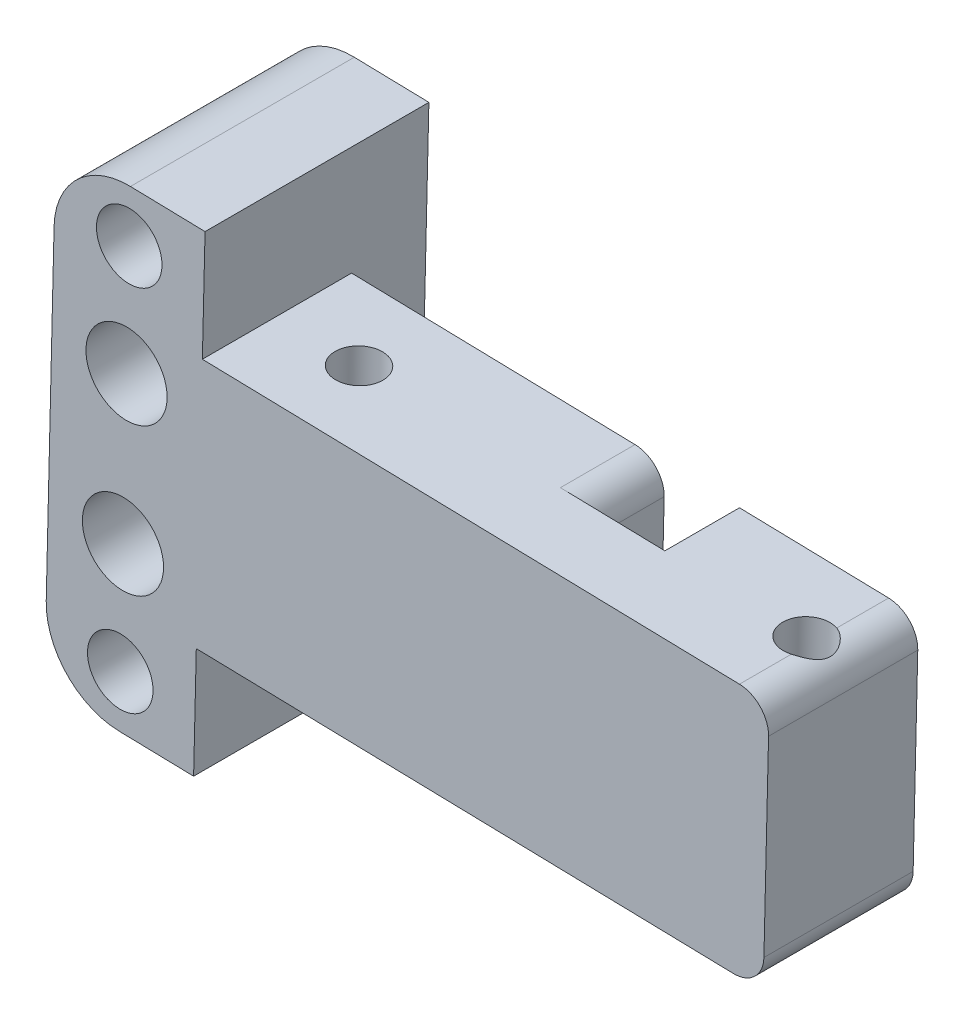
ISO-10303-21;
HEADER;
FILE_DESCRIPTION(('STEP AP214'),'2;1');
FILE_NAME('part.step','',(''),(''),'','','');
FILE_SCHEMA(('AUTOMOTIVE_DESIGN { 1 0 10303 214 1 1 1 1 }'));
ENDSEC;
DATA;
#1=APPLICATION_CONTEXT('core data for automotive mechanical design processes');
#2=APPLICATION_PROTOCOL_DEFINITION('international standard','automotive_design',2000,#1);
#3=PRODUCT_CONTEXT('',#1,'mechanical');
#4=PRODUCT('Part','Part','',(#3));
#5=PRODUCT_RELATED_PRODUCT_CATEGORY('part','',(#4));
#6=PRODUCT_DEFINITION_FORMATION('','',#4);
#7=PRODUCT_DEFINITION_CONTEXT('part definition',#1,'design');
#8=PRODUCT_DEFINITION('design','',#6,#7);
#9=PRODUCT_DEFINITION_SHAPE('','',#8);
#10=(LENGTH_UNIT() NAMED_UNIT(*) SI_UNIT(.MILLI.,.METRE.));
#11=(NAMED_UNIT(*) PLANE_ANGLE_UNIT() SI_UNIT($,.RADIAN.));
#12=(NAMED_UNIT(*) SI_UNIT($,.STERADIAN.) SOLID_ANGLE_UNIT());
#13=UNCERTAINTY_MEASURE_WITH_UNIT(LENGTH_MEASURE(1.E-05),#10,'distance_accuracy_value','');
#14=(GEOMETRIC_REPRESENTATION_CONTEXT(3) GLOBAL_UNCERTAINTY_ASSIGNED_CONTEXT((#13)) GLOBAL_UNIT_ASSIGNED_CONTEXT((#10,
#11,#12)) REPRESENTATION_CONTEXT('',''));
#15=CARTESIAN_POINT('',(0.,0.,0.));
#16=DIRECTION('',(0.,0.,1.));
#17=DIRECTION('',(1.,0.,0.));
#18=AXIS2_PLACEMENT_3D('',#15,#16,#17);
#19=CARTESIAN_POINT('',(0.,0.,-9.99999999999999));
#20=DIRECTION('',(0.,0.,-1.));
#21=DIRECTION('',(-1.,0.,0.));
#22=AXIS2_PLACEMENT_3D('',#19,#20,#21);
#23=PLANE('',#22);
#24=DIRECTION('',(-0.0239500585247725,-0.99971315620865,0.));
#25=VECTOR('',#24,1.);
#26=CARTESIAN_POINT('',(12.3427221080172,-0.295693734753971,-9.99999999999999));
#27=LINE('',#26,#25);
#28=CARTESIAN_POINT('',(12.5478530872036,8.26679634961967,-9.99999999999999));
#29=VERTEX_POINT('',#28);
#30=CARTESIAN_POINT('',(12.1407020922824,-8.72832730592735,-9.99999999999999));
#31=VERTEX_POINT('',#30);
#32=EDGE_CURVE('E180',#29,#31,#27,.T.);
#33=ORIENTED_EDGE('',*,*,#32,.F.);
#34=DIRECTION('',(-0.99971315620865,0.0239500585247725,0.));
#35=VECTOR('',#34,1.);
#36=CARTESIAN_POINT('',(22.5449846492901,8.02729576437194,-9.99999999999999));
#37=LINE('',#36,#35);
#38=CARTESIAN_POINT('',(22.5449846492901,8.02729576437194,-9.99999999999999));
#39=VERTEX_POINT('',#38);
#40=EDGE_CURVE('E188',#39,#29,#37,.T.);
#41=ORIENTED_EDGE('',*,*,#40,.F.);
#42=CARTESIAN_POINT('',(22.4970845322405,6.02786945195466,-9.99999999999999));
#43=DIRECTION('',(0.,0.,-1.));
#44=DIRECTION('',(-1.,0.,0.));
#45=AXIS2_PLACEMENT_3D('',#42,#43,#44);
#46=CIRCLE('',#45,1.99999999999999);
#47=CARTESIAN_POINT('',(24.4965108446578,5.97996933490513,-9.99999999999999));
#48=VERTEX_POINT('',#47);
#49=EDGE_CURVE('E205',#48,#39,#46,.F.);
#50=ORIENTED_EDGE('',*,*,#49,.F.);
#51=DIRECTION('',(0.0239500585247739,0.99971315620865,0.));
#52=VECTOR('',#51,1.);
#53=CARTESIAN_POINT('',(24.1851600838358,-7.0163016958073,-9.99999999999999));
#54=LINE('',#53,#52);
#55=CARTESIAN_POINT('',(24.1851600838358,-7.0163016958073,-9.99999999999999));
#56=VERTEX_POINT('',#55);
#57=EDGE_CURVE('E294',#56,#48,#54,.T.);
#58=ORIENTED_EDGE('',*,*,#57,.F.);
#59=CARTESIAN_POINT('',(22.1857337714185,-6.96840157875778,-9.99999999999999));
#60=DIRECTION('',(0.,0.,-1.));
#61=DIRECTION('',(-1.,0.,0.));
#62=AXIS2_PLACEMENT_3D('',#59,#60,#61);
#63=CIRCLE('',#62,1.99999999999999);
#64=CARTESIAN_POINT('',(22.1378336543689,-8.96782789117506,-9.99999999999999));
#65=VERTEX_POINT('',#64);
#66=EDGE_CURVE('E200',#65,#56,#63,.F.);
#67=ORIENTED_EDGE('',*,*,#66,.F.);
#68=DIRECTION('',(0.99971315620865,-0.0239500585247709,0.));
#69=VECTOR('',#68,1.);
#70=CARTESIAN_POINT('',(-13.8518399691425,-8.10562578428331,-9.99999999999999));
#71=LINE('',#70,#69);
#72=EDGE_CURVE('E191',#31,#65,#71,.T.);
#73=ORIENTED_EDGE('',*,*,#72,.F.);
#74=EDGE_LOOP('',(#33,#41,#50,#58,#67,#73));
#75=FACE_BOUND('',#74,.T.);
#76=ADVANCED_FACE('F41',(#75),#23,.T.);
#77=CARTESIAN_POINT('',(22.1857337714185,-6.96840157875778,-15.));
#78=DIRECTION('',(0.,0.,1.));
#79=DIRECTION('',(1.,0.,0.));
#80=AXIS2_PLACEMENT_3D('',#77,#78,#79);
#81=CYLINDRICAL_SURFACE('',#80,1.99999999999999);
#82=CARTESIAN_POINT('',(22.1378336543689,-8.96782789117506,-6.51986841535706));
#83=CARTESIAN_POINT('',(22.177541900737,-8.96878397799436,-6.50680601406822));
#84=CARTESIAN_POINT('',(22.2167322632791,-8.96853392166363,-6.49218826153607));
#85=CARTESIAN_POINT('',(22.2937611262488,-8.96585248375136,-6.46000515692447));
#86=CARTESIAN_POINT('',(22.3316009830091,-8.96342335862773,-6.44244286924733));
#87=CARTESIAN_POINT('',(22.4421612860829,-8.95326547218641,-6.38583593186457));
#88=CARTESIAN_POINT('',(22.5125543368794,-8.942673736842,-6.34266113831798));
#89=CARTESIAN_POINT('',(22.6450120591151,-8.91612489874949,-6.24699745860863));
#90=CARTESIAN_POINT('',(22.7071062830459,-8.90018758458956,-6.19454325711621));
#91=CARTESIAN_POINT('',(22.8225043134501,-8.86528436031947,-6.08135550889079));
#92=CARTESIAN_POINT('',(22.8757860635989,-8.84631107810625,-6.02060186290768));
#93=CARTESIAN_POINT('',(22.9779607586305,-8.80571491632614,-5.88488792564651));
#94=CARTESIAN_POINT('',(23.0257333599725,-8.78402948541162,-5.80910040734161));
#95=CARTESIAN_POINT('',(23.1082051828178,-8.74355296899215,-5.65004194896717));
#96=CARTESIAN_POINT('',(23.1429184488576,-8.7247587870576,-5.56677916819443));
#97=CARTESIAN_POINT('',(23.1938558456556,-8.69594874070684,-5.40726588752853));
#98=CARTESIAN_POINT('',(23.2120617828565,-8.68504309558687,-5.33181383140409));
#99=CARTESIAN_POINT('',(23.2371973571844,-8.66976855487254,-5.17843931700981));
#100=CARTESIAN_POINT('',(23.2441398056624,-8.66539223313202,-5.10051976835906));
#101=CARTESIAN_POINT('',(23.2463688333884,-8.66400061905943,-4.94430902103847));
#102=CARTESIAN_POINT('',(23.2416351086763,-8.66699814926009,-4.86601741159196));
#103=CARTESIAN_POINT('',(23.2207542811807,-8.6797970635782,-4.71152622664203));
#104=CARTESIAN_POINT('',(23.2045984638148,-8.68960364261491,-4.63532829467109));
#105=CARTESIAN_POINT('',(23.1618869564657,-8.71417282154921,-4.48767777576104));
#106=CARTESIAN_POINT('',(23.1354398671674,-8.72888344553564,-4.41618446428269));
#107=CARTESIAN_POINT('',(23.0729872822803,-8.76116884694338,-4.27819548939145));
#108=CARTESIAN_POINT('',(23.0369761545217,-8.77874530966703,-4.2117028004999));
#109=CARTESIAN_POINT('',(22.9495627076414,-8.81751072935956,-4.07424309639509));
#110=CARTESIAN_POINT('',(22.8966131627856,-8.83882422965046,-4.0042913828765));
#111=CARTESIAN_POINT('',(22.7796774827478,-8.87917406733733,-3.87346134589458));
#112=CARTESIAN_POINT('',(22.7156884654458,-8.89820980786581,-3.81258539963515));
#113=CARTESIAN_POINT('',(22.5856386545858,-8.92902059758542,-3.70779660461203));
#114=CARTESIAN_POINT('',(22.5206353176663,-8.94137415519279,-3.66274304576892));
#115=CARTESIAN_POINT('',(22.3841440134874,-8.95971692394135,-3.58239245193458));
#116=CARTESIAN_POINT('',(22.3126764147776,-8.96572541838129,-3.54706609831489));
#117=CARTESIAN_POINT('',(22.2223509984243,-8.96813655736832,-3.51047500282109));
#118=CARTESIAN_POINT('',(22.2055856878862,-8.96837457416751,-3.50400901702401));
#119=CARTESIAN_POINT('',(22.1718563106304,-8.9684241218161,-3.49164470692281));
#120=CARTESIAN_POINT('',(22.1548923514146,-8.96823587361531,-3.48574609018138));
#121=CARTESIAN_POINT('',(22.1378336543689,-8.96782789117506,-3.48013158464293));
#122=B_SPLINE_CURVE_WITH_KNOTS('',3,(#82,#83,#84,#85,#86,#87,#88,#89,#90,#91,#92,#93,#94,#95,
#96,#97,#98,#99,#100,#101,#102,#103,#104,#105,#106,#107,#108,#109,#110,#111,#112,#113,#114,#115,
#116,#117,#118,#119,#120,#121),.UNSPECIFIED.,.F.,.F.,(4,2,2,2,2,2,2,2,2,2,2,2,2,2,2,2,2,2,2,4),
(0.,0.12532995298044,0.250530274566233,0.498963209982654,0.746486449032049,0.99462012257345,
1.26993845971808,1.54495985619766,1.77908418993166,2.0129420380959,2.24720683353042,
2.48165055643165,2.71368457636571,2.94585554304131,3.21557159840355,3.48535817648936,
3.72455670593245,3.96302617578998,4.01692868336267,4.0708032575569),.UNSPECIFIED.);
#123=CARTESIAN_POINT('',(22.1378336543689,-8.96782789117506,-6.51986841535706));
#124=VERTEX_POINT('',#123);
#125=CARTESIAN_POINT('',(22.1378336543689,-8.96782789117506,-3.48013158464293));
#126=VERTEX_POINT('',#125);
#127=EDGE_CURVE('E344',#124,#126,#122,.T.);
#128=ORIENTED_EDGE('',*,*,#127,.F.);
#129=DIRECTION('',(0.,0.,1.));
#130=VECTOR('',#129,1.);
#131=CARTESIAN_POINT('',(22.1378336543689,-8.96782789117506,-15.));
#132=LINE('',#131,#130);
#133=EDGE_CURVE('E291',#65,#124,#132,.T.);
#134=ORIENTED_EDGE('',*,*,#133,.F.);
#135=ORIENTED_EDGE('',*,*,#66,.T.);
#136=DIRECTION('',(0.,0.,1.));
#137=VECTOR('',#136,1.);
#138=CARTESIAN_POINT('',(24.1851600838358,-7.0163016958073,-15.));
#139=LINE('',#138,#137);
#140=CARTESIAN_POINT('',(24.1851600838358,-7.0163016958073,0.));
#141=VERTEX_POINT('',#140);
#142=EDGE_CURVE('E256',#56,#141,#139,.T.);
#143=ORIENTED_EDGE('',*,*,#142,.T.);
#144=CARTESIAN_POINT('',(22.1857337714185,-6.96840157875778,0.));
#145=DIRECTION('',(0.,0.,1.));
#146=DIRECTION('',(1.,0.,0.));
#147=AXIS2_PLACEMENT_3D('',#144,#145,#146);
#148=CIRCLE('',#147,1.99999999999999);
#149=CARTESIAN_POINT('',(22.1378336543689,-8.96782789117506,0.));
#150=VERTEX_POINT('',#149);
#151=EDGE_CURVE('E234',#150,#141,#148,.T.);
#152=ORIENTED_EDGE('',*,*,#151,.F.);
#153=EDGE_CURVE('E295',#126,#150,#132,.T.);
#154=ORIENTED_EDGE('',*,*,#153,.F.);
#155=EDGE_LOOP('',(#128,#134,#135,#143,#152,#154));
#156=FACE_BOUND('',#155,.T.);
#157=ADVANCED_FACE('F355',(#156),#81,.T.);
#158=CARTESIAN_POINT('',(-13.8518399691425,-8.10562578428331,-15.));
#159=DIRECTION('',(-0.0239500585247709,-0.99971315620865,0.));
#160=DIRECTION('',(0.99971315620865,-0.0239500585247709,0.));
#161=AXIS2_PLACEMENT_3D('',#158,#159,#160);
#162=PLANE('',#161);
#163=CARTESIAN_POINT('',(-8.35341760999489,-8.23735110616955,-4.99999999999979));
#164=DIRECTION('',(-0.0239500585247709,-0.99971315620865,0.));
#165=DIRECTION('',(0.99971315620865,-0.0239500585247709,0.));
#166=AXIS2_PLACEMENT_3D('',#163,#164,#165);
#167=CIRCLE('',#166,1.6);
#168=CARTESIAN_POINT('',(-6.75387656006104,-8.27567119980918,-4.99999999999979));
#169=VERTEX_POINT('',#168);
#170=EDGE_CURVE('E426',#169,#169,#167,.T.);
#171=ORIENTED_EDGE('',*,*,#170,.F.);
#172=EDGE_LOOP('',(#171));
#173=FACE_BOUND('',#172,.T.);
#174=CARTESIAN_POINT('',(-13.8518399691425,-8.10562578428331,-10.));
#175=VERTEX_POINT('',#174);
#176=CARTESIAN_POINT('',(5.14270999882189,-8.56067689625396,-9.99999999999999));
#177=VERTEX_POINT('',#176);
#178=EDGE_CURVE('E209',#175,#177,#71,.T.);
#179=ORIENTED_EDGE('',*,*,#178,.T.);
#180=DIRECTION('',(0.,0.,-1.));
#181=VECTOR('',#180,1.);
#182=CARTESIAN_POINT('',(5.14270999882189,-8.56067689625396,-5.));
#183=LINE('',#182,#181);
#184=CARTESIAN_POINT('',(5.14270999882189,-8.56067689625396,-5.));
#185=VERTEX_POINT('',#184);
#186=EDGE_CURVE('E409',#177,#185,#183,.F.);
#187=ORIENTED_EDGE('',*,*,#186,.T.);
#188=DIRECTION('',(-0.99971315620865,0.0239500585247709,0.));
#189=VECTOR('',#188,1.);
#190=CARTESIAN_POINT('',(-13.8518399691425,-8.10562578428331,-4.99999999999999));
#191=LINE('',#190,#189);
#192=CARTESIAN_POINT('',(12.1407020922824,-8.72832730592735,-5.));
#193=VERTEX_POINT('',#192);
#194=EDGE_CURVE('E63',#193,#185,#191,.T.);
#195=ORIENTED_EDGE('',*,*,#194,.F.);
#196=DIRECTION('',(0.,0.,1.));
#197=VECTOR('',#196,1.);
#198=CARTESIAN_POINT('',(12.1407020922824,-8.72832730592735,-15.));
#199=LINE('',#198,#197);
#200=EDGE_CURVE('E496',#31,#193,#199,.T.);
#201=ORIENTED_EDGE('',*,*,#200,.F.);
#202=ORIENTED_EDGE('',*,*,#72,.T.);
#203=ORIENTED_EDGE('',*,*,#133,.T.);
#204=CARTESIAN_POINT('',(21.6379770762646,-8.95585286191267,-5.));
#205=DIRECTION('',(-0.0239500585247709,-0.99971315620865,0.));
#206=DIRECTION('',(0.99971315620865,-0.0239500585247709,0.));
#207=AXIS2_PLACEMENT_3D('',#204,#205,#206);
#208=CIRCLE('',#207,1.6);
#209=EDGE_CURVE('E352',#126,#124,#208,.T.);
#210=ORIENTED_EDGE('',*,*,#209,.F.);
#211=ORIENTED_EDGE('',*,*,#153,.T.);
#212=DIRECTION('',(0.99971315620865,-0.0239500585247709,0.));
#213=VECTOR('',#212,1.);
#214=CARTESIAN_POINT('',(-13.8518399691425,-8.10562578428331,0.));
#215=LINE('',#214,#213);
#216=CARTESIAN_POINT('',(-13.8518399691425,-8.10562578428331,0.));
#217=VERTEX_POINT('',#216);
#218=EDGE_CURVE('E241',#217,#150,#215,.T.);
#219=ORIENTED_EDGE('',*,*,#218,.F.);
#220=DIRECTION('',(0.,0.,1.));
#221=VECTOR('',#220,1.);
#222=CARTESIAN_POINT('',(-13.8518399691425,-8.10562578428331,-15.));
#223=LINE('',#222,#221);
#224=EDGE_CURVE('E296',#175,#217,#223,.T.);
#225=ORIENTED_EDGE('',*,*,#224,.F.);
#226=EDGE_LOOP('',(#179,#187,#195,#201,#202,#203,#210,#211,#219,#225));
#227=FACE_BOUND('',#226,.T.);
#228=ADVANCED_FACE('F358',(#173,#227),#162,.T.);
#229=CARTESIAN_POINT('',(22.5449846492901,8.02729576437194,-15.));
#230=DIRECTION('',(0.0239500585247724,0.99971315620865,0.));
#231=DIRECTION('',(-0.99971315620865,0.0239500585247725,0.));
#232=AXIS2_PLACEMENT_3D('',#229,#230,#231);
#233=PLANE('',#232);
#234=CARTESIAN_POINT('',(-7.94626661507375,8.7577725493775,-4.99999999999979));
#235=DIRECTION('',(0.0239500585247725,0.99971315620865,0.));
#236=DIRECTION('',(-0.99971315620865,0.0239500585247725,0.));
#237=AXIS2_PLACEMENT_3D('',#234,#235,#236);
#238=CIRCLE('',#237,1.6);
#239=CARTESIAN_POINT('',(-9.54580766500759,8.79609264301714,-4.99999999999979));
#240=VERTEX_POINT('',#239);
#241=EDGE_CURVE('E493',#240,#240,#238,.T.);
#242=ORIENTED_EDGE('',*,*,#241,.F.);
#243=EDGE_LOOP('',(#242));
#244=FACE_BOUND('',#243,.T.);
#245=DIRECTION('',(0.99971315620865,-0.0239500585247725,0.));
#246=VECTOR('',#245,1.);
#247=CARTESIAN_POINT('',(12.5478530872036,8.26679634961967,-5.));
#248=LINE('',#247,#246);
#249=CARTESIAN_POINT('',(5.54986099374301,8.43444675929308,-5.));
#250=VERTEX_POINT('',#249);
#251=CARTESIAN_POINT('',(12.5478530872036,8.26679634961967,-5.));
#252=VERTEX_POINT('',#251);
#253=EDGE_CURVE('E56',#250,#252,#248,.T.);
#254=ORIENTED_EDGE('',*,*,#253,.F.);
#255=DIRECTION('',(0.,0.,1.));
#256=VECTOR('',#255,1.);
#257=CARTESIAN_POINT('',(5.54986099374301,8.43444675929308,-9.99999999999999));
#258=LINE('',#257,#256);
#259=CARTESIAN_POINT('',(5.54986099374302,8.43444675929308,-9.99999999999999));
#260=VERTEX_POINT('',#259);
#261=EDGE_CURVE('E411',#250,#260,#258,.F.);
#262=ORIENTED_EDGE('',*,*,#261,.T.);
#263=CARTESIAN_POINT('',(-13.4446889742213,8.88949787126375,-10.));
#264=VERTEX_POINT('',#263);
#265=EDGE_CURVE('E201',#260,#264,#37,.T.);
#266=ORIENTED_EDGE('',*,*,#265,.T.);
#267=DIRECTION('',(0.,0.,1.));
#268=VECTOR('',#267,1.);
#269=CARTESIAN_POINT('',(-13.4446889742213,8.88949787126375,-15.));
#270=LINE('',#269,#268);
#271=CARTESIAN_POINT('',(-13.4446889742213,8.88949787126375,0.));
#272=VERTEX_POINT('',#271);
#273=EDGE_CURVE('E310',#264,#272,#270,.T.);
#274=ORIENTED_EDGE('',*,*,#273,.T.);
#275=DIRECTION('',(-0.99971315620865,0.0239500585247724,0.));
#276=VECTOR('',#275,1.);
#277=CARTESIAN_POINT('',(22.5449846492901,8.02729576437194,0.));
#278=LINE('',#277,#276);
#279=CARTESIAN_POINT('',(22.5449846492901,8.02729576437194,0.));
#280=VERTEX_POINT('',#279);
#281=EDGE_CURVE('E265',#280,#272,#278,.T.);
#282=ORIENTED_EDGE('',*,*,#281,.F.);
#283=DIRECTION('',(0.,0.,1.));
#284=VECTOR('',#283,1.);
#285=CARTESIAN_POINT('',(22.5449846492901,8.02729576437194,-15.));
#286=LINE('',#285,#284);
#287=CARTESIAN_POINT('',(22.5449846492901,8.02729576437194,-3.48013158464293));
#288=VERTEX_POINT('',#287);
#289=EDGE_CURVE('E313',#288,#280,#286,.T.);
#290=ORIENTED_EDGE('',*,*,#289,.F.);
#291=CARTESIAN_POINT('',(22.0451280711857,8.03927079363433,-5.));
#292=DIRECTION('',(0.0239500585247725,0.99971315620865,0.));
#293=DIRECTION('',(-0.99971315620865,0.0239500585247725,0.));
#294=AXIS2_PLACEMENT_3D('',#291,#292,#293);
#295=CIRCLE('',#294,1.6);
#296=CARTESIAN_POINT('',(22.5449846492901,8.02729576437194,-6.51986841535706));
#297=VERTEX_POINT('',#296);
#298=EDGE_CURVE('E184',#297,#288,#295,.T.);
#299=ORIENTED_EDGE('',*,*,#298,.F.);
#300=EDGE_CURVE('E199',#39,#297,#286,.T.);
#301=ORIENTED_EDGE('',*,*,#300,.F.);
#302=ORIENTED_EDGE('',*,*,#40,.T.);
#303=DIRECTION('',(0.,0.,-1.));
#304=VECTOR('',#303,1.);
#305=CARTESIAN_POINT('',(12.5478530872036,8.26679634961967,-9.99999999999999));
#306=LINE('',#305,#304);
#307=EDGE_CURVE('E177',#252,#29,#306,.T.);
#308=ORIENTED_EDGE('',*,*,#307,.F.);
#309=EDGE_LOOP('',(#254,#262,#266,#274,#282,#290,#299,#301,#302,#308));
#310=FACE_BOUND('',#309,.T.);
#311=ADVANCED_FACE('F196',(#244,#310),#233,.T.);
#312=CARTESIAN_POINT('',(22.4970845322405,6.02786945195466,-15.));
#313=DIRECTION('',(0.,0.,1.));
#314=DIRECTION('',(1.,0.,0.));
#315=AXIS2_PLACEMENT_3D('',#312,#313,#314);
#316=CYLINDRICAL_SURFACE('',#315,1.99999999999999);
#317=CARTESIAN_POINT('',(22.5449846492901,8.02729576437194,-3.48013158464293));
#318=CARTESIAN_POINT('',(22.5846931254707,8.02634927029484,-3.49319398593177));
#319=CARTESIAN_POINT('',(22.6238265541215,8.02422281634815,-3.50781173846392));
#320=CARTESIAN_POINT('',(22.7006386444153,8.01785582142257,-3.53999484307551));
#321=CARTESIAN_POINT('',(22.7383187688886,8.01361746936309,-3.55755713075266));
#322=CARTESIAN_POINT('',(22.8482658116284,7.99817690378068,-3.61416406813542));
#323=CARTESIAN_POINT('',(22.9180709069365,7.98422645120482,-3.657338861682));
#324=CARTESIAN_POINT('',(23.0491053445932,7.95136514977116,-3.75300254139135));
#325=CARTESIAN_POINT('',(23.1103651531344,7.93247265163807,-3.80545674288377));
#326=CARTESIAN_POINT('',(23.2239594087312,7.8920834751052,-3.91864449110919));
#327=CARTESIAN_POINT('',(23.2762714717424,7.87058048925716,-3.9793981370923));
#328=CARTESIAN_POINT('',(23.3763849477643,7.82513812383803,-4.11511207435346));
#329=CARTESIAN_POINT('',(23.4230643071468,7.80118991387226,-4.19089959265836));
#330=CARTESIAN_POINT('',(23.5035032437093,7.75681055572474,-4.3499580510328));
#331=CARTESIAN_POINT('',(23.5372767010368,7.73637564212367,-4.43322083180554));
#332=CARTESIAN_POINT('',(23.5867760531663,7.70515943956709,-4.59273411247144));
#333=CARTESIAN_POINT('',(23.6044388724872,7.69339448914282,-4.66818616859588));
#334=CARTESIAN_POINT('',(23.6288141685994,7.67693381995025,-4.82156068299015));
#335=CARTESIAN_POINT('',(23.6355390864332,7.67223007006595,-4.89948023164091));
#336=CARTESIAN_POINT('',(23.6376989176387,7.67073331240531,-5.0556909789615));
#337=CARTESIAN_POINT('',(23.6331141643675,7.67395408473465,-5.13398258840801));
#338=CARTESIAN_POINT('',(23.6128701852175,7.68773822318416,-5.28847377335795));
#339=CARTESIAN_POINT('',(23.5972025035194,7.69830719557372,-5.36467170532888));
#340=CARTESIAN_POINT('',(23.5557165242345,7.72489348783697,-5.51232222423894));
#341=CARTESIAN_POINT('',(23.5300042138066,7.74085369093347,-5.58381553571729));
#342=CARTESIAN_POINT('',(23.4691693060971,7.77609268222319,-5.72180451060853));
#343=CARTESIAN_POINT('',(23.43404116381,7.79537342348957,-5.78829719950008));
#344=CARTESIAN_POINT('',(23.3485843340728,7.83828028437097,-5.9257569036049));
#345=CARTESIAN_POINT('',(23.2967161598108,7.86210489546572,-5.99570861712348));
#346=CARTESIAN_POINT('',(23.1818468371728,7.90800806947305,-6.12653865410541));
#347=CARTESIAN_POINT('',(23.1188427814014,7.93008617421716,-6.18741460036484));
#348=CARTESIAN_POINT('',(22.9904175821621,7.96708923176942,-6.29220339538795));
#349=CARTESIAN_POINT('',(22.9260803848795,7.98254139155536,-6.33725695423107));
#350=CARTESIAN_POINT('',(22.7906240337156,8.00739919136126,-6.41760754806541));
#351=CARTESIAN_POINT('',(22.7195261484242,8.01682311718193,-6.4529339016851));
#352=CARTESIAN_POINT('',(22.6294198150577,8.02355684704283,-6.4895249971789));
#353=CARTESIAN_POINT('',(22.6126851356239,8.0245974207709,-6.49599098297598));
#354=CARTESIAN_POINT('',(22.5789968257248,8.02626208925984,-6.50835529307719));
#355=CARTESIAN_POINT('',(22.5620433132185,8.02688639956918,-6.51425390981862));
#356=CARTESIAN_POINT('',(22.5449846492901,8.02729576437194,-6.51986841535707));
#357=B_SPLINE_CURVE_WITH_KNOTS('',3,(#317,#318,#319,#320,#321,#322,#323,#324,#325,#326,#327,
#328,#329,#330,#331,#332,#333,#334,#335,#336,#337,#338,#339,#340,#341,#342,#343,#344,#345,#346,
#347,#348,#349,#350,#351,#352,#353,#354,#355,#356),.UNSPECIFIED.,.F.,.F.,(4,2,2,2,2,2,2,2,2,2,2,
2,2,2,2,2,2,2,2,4),(0.,0.12532995298044,0.250530274566229,0.498963209982648,0.746486449032041,
0.994620122573444,1.26993845971807,1.54495985619764,1.77908418993165,2.01294203809589,
2.24720683353041,2.48165055643164,2.71368457636571,2.94585554304131,3.21557159840356,
3.48535817648935,3.72455670593244,3.96302617578997,4.01692868336268,4.07080325755693),.UNSPECIFIED.);
#358=EDGE_CURVE('E192',#288,#297,#357,.T.);
#359=ORIENTED_EDGE('',*,*,#358,.F.);
#360=ORIENTED_EDGE('',*,*,#289,.T.);
#361=CARTESIAN_POINT('',(22.4970845322405,6.02786945195466,0.));
#362=DIRECTION('',(0.,0.,1.));
#363=DIRECTION('',(1.,0.,0.));
#364=AXIS2_PLACEMENT_3D('',#361,#362,#363);
#365=CIRCLE('',#364,1.99999999999999);
#366=CARTESIAN_POINT('',(24.4965108446578,5.97996933490513,0.));
#367=VERTEX_POINT('',#366);
#368=EDGE_CURVE('E262',#367,#280,#365,.T.);
#369=ORIENTED_EDGE('',*,*,#368,.F.);
#370=DIRECTION('',(0.,0.,1.));
#371=VECTOR('',#370,1.);
#372=CARTESIAN_POINT('',(24.4965108446578,5.97996933490513,-15.));
#373=LINE('',#372,#371);
#374=EDGE_CURVE('E314',#48,#367,#373,.T.);
#375=ORIENTED_EDGE('',*,*,#374,.F.);
#376=ORIENTED_EDGE('',*,*,#49,.T.);
#377=ORIENTED_EDGE('',*,*,#300,.T.);
#378=EDGE_LOOP('',(#359,#360,#369,#375,#376,#377));
#379=FACE_BOUND('',#378,.T.);
#380=ADVANCED_FACE('F330',(#379),#316,.T.);
#381=CARTESIAN_POINT('',(24.1851600838358,-7.0163016958073,-15.));
#382=DIRECTION('',(0.99971315620865,-0.0239500585247739,0.));
#383=DIRECTION('',(0.0239500585247739,0.99971315620865,0.));
#384=AXIS2_PLACEMENT_3D('',#381,#382,#383);
#385=PLANE('',#384);
#386=ORIENTED_EDGE('',*,*,#142,.F.);
#387=ORIENTED_EDGE('',*,*,#57,.T.);
#388=ORIENTED_EDGE('',*,*,#374,.T.);
#389=DIRECTION('',(0.0239500585247739,0.99971315620865,0.));
#390=VECTOR('',#389,1.);
#391=CARTESIAN_POINT('',(24.1851600838358,-7.0163016958073,0.));
#392=LINE('',#391,#390);
#393=EDGE_CURVE('E259',#141,#367,#392,.T.);
#394=ORIENTED_EDGE('',*,*,#393,.F.);
#395=EDGE_LOOP('',(#386,#387,#388,#394));
#396=FACE_BOUND('',#395,.T.);
#397=ADVANCED_FACE('F360',(#396),#385,.T.);
#398=CARTESIAN_POINT('',(-14.0314654080783,-15.6034744558481,-15.));
#399=DIRECTION('',(0.99971315620865,-0.0239500585247726,0.));
#400=DIRECTION('',(0.0239500585247726,0.99971315620865,0.));
#401=AXIS2_PLACEMENT_3D('',#398,#399,#400);
#402=PLANE('',#401);
#403=DIRECTION('',(0.0239500585247726,0.99971315620865,0.));
#404=VECTOR('',#403,1.);
#405=CARTESIAN_POINT('',(-14.0314654080783,-15.6034744558481,0.));
#406=LINE('',#405,#404);
#407=CARTESIAN_POINT('',(-14.0314654080783,-15.6034744558481,0.));
#408=VERTEX_POINT('',#407);
#409=EDGE_CURVE('E286',#408,#217,#406,.T.);
#410=ORIENTED_EDGE('',*,*,#409,.F.);
#411=DIRECTION('',(0.,0.,1.));
#412=VECTOR('',#411,1.);
#413=CARTESIAN_POINT('',(-14.0314654080783,-15.6034744558481,-15.));
#414=LINE('',#413,#412);
#415=CARTESIAN_POINT('',(-14.0314654080783,-15.6034744558481,-15.));
#416=VERTEX_POINT('',#415);
#417=EDGE_CURVE('E298',#416,#408,#414,.T.);
#418=ORIENTED_EDGE('',*,*,#417,.F.);
#419=DIRECTION('',(0.023950058524765,0.99971315620865,0.));
#420=VECTOR('',#419,1.);
#421=CARTESIAN_POINT('',(-13.4446889742213,8.88949787126375,-15.));
#422=LINE('',#421,#420);
#423=CARTESIAN_POINT('',(-13.2650635352856,16.3873465428286,-15.));
#424=VERTEX_POINT('',#423);
#425=EDGE_CURVE('E237',#416,#424,#422,.T.);
#426=ORIENTED_EDGE('',*,*,#425,.T.);
#427=DIRECTION('',(0.,0.,1.));
#428=VECTOR('',#427,1.);
#429=CARTESIAN_POINT('',(-13.2650635352856,16.3873465428286,-15.));
#430=LINE('',#429,#428);
#431=CARTESIAN_POINT('',(-13.2650635352856,16.3873465428286,0.));
#432=VERTEX_POINT('',#431);
#433=EDGE_CURVE('E308',#424,#432,#430,.T.);
#434=ORIENTED_EDGE('',*,*,#433,.T.);
#435=DIRECTION('',(0.023950058524765,0.99971315620865,0.));
#436=VECTOR('',#435,1.);
#437=CARTESIAN_POINT('',(-13.4446889742213,8.88949787126375,0.));
#438=LINE('',#437,#436);
#439=EDGE_CURVE('E268',#272,#432,#438,.T.);
#440=ORIENTED_EDGE('',*,*,#439,.F.);
#441=ORIENTED_EDGE('',*,*,#273,.F.);
#442=DIRECTION('',(0.0239500585247746,0.99971315620865,0.));
#443=VECTOR('',#442,1.);
#444=CARTESIAN_POINT('',(-13.4446889742213,8.88949787126375,-10.));
#445=LINE('',#444,#443);
#446=EDGE_CURVE('E420',#175,#264,#445,.T.);
#447=ORIENTED_EDGE('',*,*,#446,.F.);
#448=ORIENTED_EDGE('',*,*,#224,.T.);
#449=EDGE_LOOP('',(#410,#418,#426,#434,#440,#441,#447,#448));
#450=FACE_BOUND('',#449,.T.);
#451=ADVANCED_FACE('F424',(#450),#402,.T.);
#452=CARTESIAN_POINT('',(-19.0300311891215,-15.4837241632243,-15.));
#453=DIRECTION('',(-0.0239500585247688,-0.99971315620865,0.));
#454=DIRECTION('',(0.99971315620865,-0.0239500585247688,0.));
#455=AXIS2_PLACEMENT_3D('',#452,#453,#454);
#456=PLANE('',#455);
#457=DIRECTION('',(0.99971315620865,-0.0239500585247688,0.));
#458=VECTOR('',#457,1.);
#459=CARTESIAN_POINT('',(-19.0300311891215,-15.4837241632243,0.));
#460=LINE('',#459,#458);
#461=CARTESIAN_POINT('',(-19.0300311891215,-15.4837241632243,0.));
#462=VERTEX_POINT('',#461);
#463=EDGE_CURVE('E283',#462,#408,#460,.T.);
#464=ORIENTED_EDGE('',*,*,#463,.F.);
#465=DIRECTION('',(0.,0.,1.));
#466=VECTOR('',#465,1.);
#467=CARTESIAN_POINT('',(-19.0300311891215,-15.4837241632243,-15.));
#468=LINE('',#467,#466);
#469=CARTESIAN_POINT('',(-19.0300311891215,-15.4837241632243,-15.));
#470=VERTEX_POINT('',#469);
#471=EDGE_CURVE('E300',#470,#462,#468,.T.);
#472=ORIENTED_EDGE('',*,*,#471,.F.);
#473=DIRECTION('',(0.99971315620865,-0.0239500585247688,0.));
#474=VECTOR('',#473,1.);
#475=CARTESIAN_POINT('',(-19.0300311891215,-15.4837241632243,-15.));
#476=LINE('',#475,#474);
#477=EDGE_CURVE('E253',#470,#416,#476,.T.);
#478=ORIENTED_EDGE('',*,*,#477,.T.);
#479=ORIENTED_EDGE('',*,*,#417,.T.);
#480=EDGE_LOOP('',(#464,#472,#478,#479));
#481=FACE_BOUND('',#480,.T.);
#482=ADVANCED_FACE('F442',(#481),#456,.T.);
#483=CARTESIAN_POINT('',(-18.9102808964977,-10.4851583821811,-15.));
#484=DIRECTION('',(0.,0.,1.));
#485=DIRECTION('',(1.,0.,0.));
#486=AXIS2_PLACEMENT_3D('',#483,#484,#485);
#487=CYLINDRICAL_SURFACE('',#486,4.99999999999999);
#488=CARTESIAN_POINT('',(-18.9102808964977,-10.4851583821811,0.));
#489=DIRECTION('',(0.,0.,1.));
#490=DIRECTION('',(1.,0.,0.));
#491=AXIS2_PLACEMENT_3D('',#488,#489,#490);
#492=CIRCLE('',#491,4.99999999999999);
#493=CARTESIAN_POINT('',(-23.9088466775409,-10.3654080895572,0.));
#494=VERTEX_POINT('',#493);
#495=EDGE_CURVE('E280',#494,#462,#492,.T.);
#496=ORIENTED_EDGE('',*,*,#495,.F.);
#497=DIRECTION('',(0.,0.,1.));
#498=VECTOR('',#497,1.);
#499=CARTESIAN_POINT('',(-23.9088466775409,-10.3654080895572,-15.));
#500=LINE('',#499,#498);
#501=CARTESIAN_POINT('',(-23.9088466775409,-10.3654080895572,-15.));
#502=VERTEX_POINT('',#501);
#503=EDGE_CURVE('E302',#502,#494,#500,.T.);
#504=ORIENTED_EDGE('',*,*,#503,.F.);
#505=CARTESIAN_POINT('',(-18.9102808964977,-10.4851583821811,-15.));
#506=DIRECTION('',(0.,0.,1.));
#507=DIRECTION('',(1.,0.,0.));
#508=AXIS2_PLACEMENT_3D('',#505,#506,#507);
#509=CIRCLE('',#508,4.99999999999999);
#510=EDGE_CURVE('E250',#502,#470,#509,.T.);
#511=ORIENTED_EDGE('',*,*,#510,.T.);
#512=ORIENTED_EDGE('',*,*,#471,.T.);
#513=EDGE_LOOP('',(#496,#504,#511,#512));
#514=FACE_BOUND('',#513,.T.);
#515=ADVANCED_FACE('F445',(#514),#487,.T.);
#516=CARTESIAN_POINT('',(-23.3819453899959,11.6282813470331,-15.));
#517=DIRECTION('',(-0.99971315620865,0.0239500585247733,0.));
#518=DIRECTION('',(-0.0239500585247733,-0.99971315620865,0.));
#519=AXIS2_PLACEMENT_3D('',#516,#517,#518);
#520=PLANE('',#519);
#521=DIRECTION('',(-0.0239500585247733,-0.99971315620865,0.));
#522=VECTOR('',#521,1.);
#523=CARTESIAN_POINT('',(-23.3819453899959,11.6282813470331,0.));
#524=LINE('',#523,#522);
#525=CARTESIAN_POINT('',(-23.3819453899959,11.6282813470331,0.));
#526=VERTEX_POINT('',#525);
#527=EDGE_CURVE('E277',#526,#494,#524,.T.);
#528=ORIENTED_EDGE('',*,*,#527,.F.);
#529=DIRECTION('',(0.,0.,1.));
#530=VECTOR('',#529,1.);
#531=CARTESIAN_POINT('',(-23.3819453899959,11.6282813470331,-15.));
#532=LINE('',#531,#530);
#533=CARTESIAN_POINT('',(-23.3819453899959,11.6282813470331,-15.));
#534=VERTEX_POINT('',#533);
#535=EDGE_CURVE('E304',#534,#526,#532,.T.);
#536=ORIENTED_EDGE('',*,*,#535,.F.);
#537=DIRECTION('',(-0.0239500585247733,-0.99971315620865,0.));
#538=VECTOR('',#537,1.);
#539=CARTESIAN_POINT('',(-23.3819453899959,11.6282813470331,-15.));
#540=LINE('',#539,#538);
#541=EDGE_CURVE('E247',#534,#502,#540,.T.);
#542=ORIENTED_EDGE('',*,*,#541,.T.);
#543=ORIENTED_EDGE('',*,*,#503,.T.);
#544=EDGE_LOOP('',(#528,#536,#542,#543));
#545=FACE_BOUND('',#544,.T.);
#546=ADVANCED_FACE('F449',(#545),#520,.T.);
#547=CARTESIAN_POINT('',(-18.3833796089526,11.5085310544092,-15.));
#548=DIRECTION('',(0.,0.,1.));
#549=DIRECTION('',(1.,0.,0.));
#550=AXIS2_PLACEMENT_3D('',#547,#548,#549);
#551=CYLINDRICAL_SURFACE('',#550,4.99999999999999);
#552=CARTESIAN_POINT('',(-18.3833796089526,11.5085310544092,0.));
#553=DIRECTION('',(0.,0.,1.));
#554=DIRECTION('',(1.,0.,0.));
#555=AXIS2_PLACEMENT_3D('',#552,#553,#554);
#556=CIRCLE('',#555,4.99999999999999);
#557=CARTESIAN_POINT('',(-18.2636293163288,16.5070968354525,0.));
#558=VERTEX_POINT('',#557);
#559=EDGE_CURVE('E274',#558,#526,#556,.T.);
#560=ORIENTED_EDGE('',*,*,#559,.F.);
#561=DIRECTION('',(0.,0.,1.));
#562=VECTOR('',#561,1.);
#563=CARTESIAN_POINT('',(-18.2636293163288,16.5070968354525,-15.));
#564=LINE('',#563,#562);
#565=CARTESIAN_POINT('',(-18.2636293163288,16.5070968354525,-15.));
#566=VERTEX_POINT('',#565);
#567=EDGE_CURVE('E306',#566,#558,#564,.T.);
#568=ORIENTED_EDGE('',*,*,#567,.F.);
#569=CARTESIAN_POINT('',(-18.3833796089526,11.5085310544092,-15.));
#570=DIRECTION('',(0.,0.,1.));
#571=DIRECTION('',(1.,0.,0.));
#572=AXIS2_PLACEMENT_3D('',#569,#570,#571);
#573=CIRCLE('',#572,4.99999999999999);
#574=EDGE_CURVE('E244',#566,#534,#573,.T.);
#575=ORIENTED_EDGE('',*,*,#574,.T.);
#576=ORIENTED_EDGE('',*,*,#535,.T.);
#577=EDGE_LOOP('',(#560,#568,#575,#576));
#578=FACE_BOUND('',#577,.T.);
#579=ADVANCED_FACE('F453',(#578),#551,.T.);
#580=CARTESIAN_POINT('',(-13.2650635352856,16.3873465428286,-15.));
#581=DIRECTION('',(0.0239500585247688,0.99971315620865,0.));
#582=DIRECTION('',(-0.99971315620865,0.0239500585247688,0.));
#583=AXIS2_PLACEMENT_3D('',#580,#581,#582);
#584=PLANE('',#583);
#585=DIRECTION('',(-0.99971315620865,0.0239500585247688,0.));
#586=VECTOR('',#585,1.);
#587=CARTESIAN_POINT('',(-13.2650635352856,16.3873465428286,0.));
#588=LINE('',#587,#586);
#589=EDGE_CURVE('E271',#432,#558,#588,.T.);
#590=ORIENTED_EDGE('',*,*,#589,.F.);
#591=ORIENTED_EDGE('',*,*,#433,.F.);
#592=DIRECTION('',(-0.99971315620865,0.0239500585247688,0.));
#593=VECTOR('',#592,1.);
#594=CARTESIAN_POINT('',(-13.2650635352856,16.3873465428286,-15.));
#595=LINE('',#594,#593);
#596=EDGE_CURVE('E240',#424,#566,#595,.T.);
#597=ORIENTED_EDGE('',*,*,#596,.T.);
#598=ORIENTED_EDGE('',*,*,#567,.T.);
#599=EDGE_LOOP('',(#590,#591,#597,#598));
#600=FACE_BOUND('',#599,.T.);
#601=ADVANCED_FACE('F457',(#600),#584,.T.);
#602=CARTESIAN_POINT('',(22.1857337714185,-6.96840157875778,-15.));
#603=DIRECTION('',(0.,0.,1.));
#604=DIRECTION('',(1.,0.,0.));
#605=AXIS2_PLACEMENT_3D('',#602,#603,#604);
#606=PLANE('',#605);
#607=CARTESIAN_POINT('',(-18.3474545211655,13.0081007887222,-15.));
#608=DIRECTION('',(0.,0.,1.));
#609=DIRECTION('',(1.,0.,0.));
#610=AXIS2_PLACEMENT_3D('',#607,#608,#609);
#611=CIRCLE('',#610,2.19638865502019);
#612=CARTESIAN_POINT('',(-16.1510658661453,13.0081007887222,-15.));
#613=VERTEX_POINT('',#612);
#614=EDGE_CURVE('E213',#613,#613,#611,.T.);
#615=ORIENTED_EDGE('',*,*,#614,.T.);
#616=EDGE_LOOP('',(#615));
#617=FACE_BOUND('',#616,.T.);
#618=CARTESIAN_POINT('',(-18.5270799601013,5.51025211715733,-15.));
#619=DIRECTION('',(0.,0.,1.));
#620=DIRECTION('',(1.,0.,0.));
#621=AXIS2_PLACEMENT_3D('',#618,#619,#620);
#622=CIRCLE('',#621,2.72007986301725);
#623=CARTESIAN_POINT('',(-15.807000097084,5.51025211715733,-15.));
#624=VERTEX_POINT('',#623);
#625=EDGE_CURVE('E219',#624,#624,#622,.T.);
#626=ORIENTED_EDGE('',*,*,#625,.T.);
#627=EDGE_LOOP('',(#626));
#628=FACE_BOUND('',#627,.T.);
#629=CARTESIAN_POINT('',(-18.766580545349,-4.48687944492915,-15.));
#630=DIRECTION('',(0.,0.,1.));
#631=DIRECTION('',(1.,0.,0.));
#632=AXIS2_PLACEMENT_3D('',#629,#630,#631);
#633=CIRCLE('',#632,2.72007986301725);
#634=CARTESIAN_POINT('',(-16.0465006823318,-4.48687944492915,-15.));
#635=VERTEX_POINT('',#634);
#636=EDGE_CURVE('E225',#635,#635,#633,.T.);
#637=ORIENTED_EDGE('',*,*,#636,.T.);
#638=EDGE_LOOP('',(#637));
#639=FACE_BOUND('',#638,.T.);
#640=CARTESIAN_POINT('',(-18.9462059842848,-11.984728116494,-15.));
#641=DIRECTION('',(0.,0.,1.));
#642=DIRECTION('',(1.,0.,0.));
#643=AXIS2_PLACEMENT_3D('',#640,#641,#642);
#644=CIRCLE('',#643,2.19638865502019);
#645=CARTESIAN_POINT('',(-16.7498173292646,-11.984728116494,-15.));
#646=VERTEX_POINT('',#645);
#647=EDGE_CURVE('E231',#646,#646,#644,.T.);
#648=ORIENTED_EDGE('',*,*,#647,.T.);
#649=EDGE_LOOP('',(#648));
#650=FACE_BOUND('',#649,.T.);
#651=ORIENTED_EDGE('',*,*,#425,.F.);
#652=ORIENTED_EDGE('',*,*,#477,.F.);
#653=ORIENTED_EDGE('',*,*,#510,.F.);
#654=ORIENTED_EDGE('',*,*,#541,.F.);
#655=ORIENTED_EDGE('',*,*,#574,.F.);
#656=ORIENTED_EDGE('',*,*,#596,.F.);
#657=EDGE_LOOP('',(#651,#652,#653,#654,#655,#656));
#658=FACE_BOUND('',#657,.T.);
#659=ADVANCED_FACE('F460',(#617,#628,#639,#650,#658),#606,.F.);
#660=CARTESIAN_POINT('',(22.1857337714185,-6.96840157875778,0.));
#661=DIRECTION('',(0.,0.,1.));
#662=DIRECTION('',(1.,0.,0.));
#663=AXIS2_PLACEMENT_3D('',#660,#661,#662);
#664=PLANE('',#663);
#665=CARTESIAN_POINT('',(-18.3474545211655,13.0081007887222,0.));
#666=DIRECTION('',(0.,0.,1.));
#667=DIRECTION('',(1.,0.,0.));
#668=AXIS2_PLACEMENT_3D('',#665,#666,#667);
#669=CIRCLE('',#668,2.19638865502019);
#670=CARTESIAN_POINT('',(-16.1510658661453,13.0081007887222,0.));
#671=VERTEX_POINT('',#670);
#672=EDGE_CURVE('E212',#671,#671,#669,.T.);
#673=ORIENTED_EDGE('',*,*,#672,.F.);
#674=EDGE_LOOP('',(#673));
#675=FACE_BOUND('',#674,.T.);
#676=CARTESIAN_POINT('',(-18.5270799601013,5.51025211715733,0.));
#677=DIRECTION('',(0.,0.,1.));
#678=DIRECTION('',(1.,0.,0.));
#679=AXIS2_PLACEMENT_3D('',#676,#677,#678);
#680=CIRCLE('',#679,2.72007986301725);
#681=CARTESIAN_POINT('',(-15.807000097084,5.51025211715733,0.));
#682=VERTEX_POINT('',#681);
#683=EDGE_CURVE('E216',#682,#682,#680,.T.);
#684=ORIENTED_EDGE('',*,*,#683,.F.);
#685=EDGE_LOOP('',(#684));
#686=FACE_BOUND('',#685,.T.);
#687=CARTESIAN_POINT('',(-18.766580545349,-4.48687944492915,0.));
#688=DIRECTION('',(0.,0.,1.));
#689=DIRECTION('',(1.,0.,0.));
#690=AXIS2_PLACEMENT_3D('',#687,#688,#689);
#691=CIRCLE('',#690,2.72007986301725);
#692=CARTESIAN_POINT('',(-16.0465006823318,-4.48687944492915,0.));
#693=VERTEX_POINT('',#692);
#694=EDGE_CURVE('E222',#693,#693,#691,.T.);
#695=ORIENTED_EDGE('',*,*,#694,.F.);
#696=EDGE_LOOP('',(#695));
#697=FACE_BOUND('',#696,.T.);
#698=CARTESIAN_POINT('',(-18.9462059842848,-11.984728116494,0.));
#699=DIRECTION('',(0.,0.,1.));
#700=DIRECTION('',(1.,0.,0.));
#701=AXIS2_PLACEMENT_3D('',#698,#699,#700);
#702=CIRCLE('',#701,2.19638865502019);
#703=CARTESIAN_POINT('',(-16.7498173292646,-11.984728116494,0.));
#704=VERTEX_POINT('',#703);
#705=EDGE_CURVE('E228',#704,#704,#702,.T.);
#706=ORIENTED_EDGE('',*,*,#705,.F.);
#707=EDGE_LOOP('',(#706));
#708=FACE_BOUND('',#707,.T.);
#709=ORIENTED_EDGE('',*,*,#151,.T.);
#710=ORIENTED_EDGE('',*,*,#393,.T.);
#711=ORIENTED_EDGE('',*,*,#368,.T.);
#712=ORIENTED_EDGE('',*,*,#281,.T.);
#713=ORIENTED_EDGE('',*,*,#439,.T.);
#714=ORIENTED_EDGE('',*,*,#589,.T.);
#715=ORIENTED_EDGE('',*,*,#559,.T.);
#716=ORIENTED_EDGE('',*,*,#527,.T.);
#717=ORIENTED_EDGE('',*,*,#495,.T.);
#718=ORIENTED_EDGE('',*,*,#463,.T.);
#719=ORIENTED_EDGE('',*,*,#409,.T.);
#720=ORIENTED_EDGE('',*,*,#218,.T.);
#721=EDGE_LOOP('',(#709,#710,#711,#712,#713,#714,#715,#716,#717,#718,#719,#720));
#722=FACE_BOUND('',#721,.T.);
#723=ADVANCED_FACE('F438',(#675,#686,#697,#708,#722),#664,.T.);
#724=CARTESIAN_POINT('',(-18.9462059842848,-11.984728116494,-15.));
#725=DIRECTION('',(0.,0.,1.));
#726=DIRECTION('',(1.,0.,0.));
#727=AXIS2_PLACEMENT_3D('',#724,#725,#726);
#728=CYLINDRICAL_SURFACE('',#727,2.19638865502019);
#729=ORIENTED_EDGE('',*,*,#705,.T.);
#730=EDGE_LOOP('',(#729));
#731=FACE_BOUND('',#730,.T.);
#732=ORIENTED_EDGE('',*,*,#647,.F.);
#733=EDGE_LOOP('',(#732));
#734=FACE_BOUND('',#733,.T.);
#735=ADVANCED_FACE('F534',(#731,#734),#728,.F.);
#736=CARTESIAN_POINT('',(-18.766580545349,-4.48687944492915,-15.));
#737=DIRECTION('',(0.,0.,1.));
#738=DIRECTION('',(1.,0.,0.));
#739=AXIS2_PLACEMENT_3D('',#736,#737,#738);
#740=CYLINDRICAL_SURFACE('',#739,2.72007986301725);
#741=ORIENTED_EDGE('',*,*,#694,.T.);
#742=EDGE_LOOP('',(#741));
#743=FACE_BOUND('',#742,.T.);
#744=ORIENTED_EDGE('',*,*,#636,.F.);
#745=EDGE_LOOP('',(#744));
#746=FACE_BOUND('',#745,.T.);
#747=ADVANCED_FACE('F543',(#743,#746),#740,.F.);
#748=CARTESIAN_POINT('',(-18.5270799601013,5.51025211715733,-15.));
#749=DIRECTION('',(0.,0.,1.));
#750=DIRECTION('',(1.,0.,0.));
#751=AXIS2_PLACEMENT_3D('',#748,#749,#750);
#752=CYLINDRICAL_SURFACE('',#751,2.72007986301725);
#753=ORIENTED_EDGE('',*,*,#683,.T.);
#754=EDGE_LOOP('',(#753));
#755=FACE_BOUND('',#754,.T.);
#756=ORIENTED_EDGE('',*,*,#625,.F.);
#757=EDGE_LOOP('',(#756));
#758=FACE_BOUND('',#757,.T.);
#759=ADVANCED_FACE('F390',(#755,#758),#752,.F.);
#760=CARTESIAN_POINT('',(-18.3474545211655,13.0081007887222,-15.));
#761=DIRECTION('',(0.,0.,1.));
#762=DIRECTION('',(1.,0.,0.));
#763=AXIS2_PLACEMENT_3D('',#760,#761,#762);
#764=CYLINDRICAL_SURFACE('',#763,2.19638865502019);
#765=ORIENTED_EDGE('',*,*,#672,.T.);
#766=EDGE_LOOP('',(#765));
#767=FACE_BOUND('',#766,.T.);
#768=ORIENTED_EDGE('',*,*,#614,.F.);
#769=EDGE_LOOP('',(#768));
#770=FACE_BOUND('',#769,.T.);
#771=ADVANCED_FACE('F381',(#767,#770),#764,.F.);
#772=DIRECTION('',(0.0239500585247725,0.99971315620865,0.));
#773=VECTOR('',#772,1.);
#774=CARTESIAN_POINT('',(7.34415632697399,-0.175943442130109,-9.99999999999999));
#775=LINE('',#774,#773);
#776=CARTESIAN_POINT('',(7.19003642828873,-6.6091507008862,-9.99999999999999));
#777=VERTEX_POINT('',#776);
#778=CARTESIAN_POINT('',(7.50138718911077,6.38712032982623,-9.99999999999999));
#779=VERTEX_POINT('',#778);
#780=EDGE_CURVE('E193',#777,#779,#775,.T.);
#781=ORIENTED_EDGE('',*,*,#780,.F.);
#782=CARTESIAN_POINT('',(5.19061011587143,-6.56125058383666,-9.99999999999999));
#783=DIRECTION('',(0.,0.,-1.));
#784=DIRECTION('',(-1.,0.,0.));
#785=AXIS2_PLACEMENT_3D('',#782,#783,#784);
#786=CIRCLE('',#785,2.);
#787=EDGE_CURVE('E393',#777,#177,#786,.T.);
#788=ORIENTED_EDGE('',*,*,#787,.T.);
#789=ORIENTED_EDGE('',*,*,#178,.F.);
#790=ORIENTED_EDGE('',*,*,#446,.T.);
#791=ORIENTED_EDGE('',*,*,#265,.F.);
#792=CARTESIAN_POINT('',(5.50196087669347,6.43502044687578,-9.99999999999999));
#793=DIRECTION('',(0.,0.,-1.));
#794=DIRECTION('',(-1.,0.,0.));
#795=AXIS2_PLACEMENT_3D('',#792,#793,#794);
#796=CIRCLE('',#795,2.);
#797=EDGE_CURVE('E396',#260,#779,#796,.T.);
#798=ORIENTED_EDGE('',*,*,#797,.T.);
#799=EDGE_LOOP('',(#781,#788,#789,#790,#791,#798));
#800=FACE_BOUND('',#799,.T.);
#801=ADVANCED_FACE('F374',(#800),#23,.T.);
#802=CARTESIAN_POINT('',(12.0209517996586,-13.7268930869706,-9.99999999999999));
#803=DIRECTION('',(0.99971315620865,-0.0239500585247725,0.));
#804=DIRECTION('',(0.0239500585247725,0.99971315620865,0.));
#805=AXIS2_PLACEMENT_3D('',#802,#803,#804);
#806=PLANE('',#805);
#807=ORIENTED_EDGE('',*,*,#200,.T.);
#808=DIRECTION('',(0.0239500585247725,0.99971315620865,0.));
#809=VECTOR('',#808,1.);
#810=CARTESIAN_POINT('',(12.0209517996586,-13.7268930869706,-5.));
#811=LINE('',#810,#809);
#812=EDGE_CURVE('E182',#193,#252,#811,.T.);
#813=ORIENTED_EDGE('',*,*,#812,.T.);
#814=ORIENTED_EDGE('',*,*,#307,.T.);
#815=ORIENTED_EDGE('',*,*,#32,.T.);
#816=EDGE_LOOP('',(#807,#813,#814,#815));
#817=FACE_BOUND('',#816,.T.);
#818=ADVANCED_FACE('F179',(#817),#806,.F.);
#819=CARTESIAN_POINT('',(12.0209517996586,-13.7268930869706,-5.));
#820=DIRECTION('',(0.,0.,1.));
#821=DIRECTION('',(1.,0.,0.));
#822=AXIS2_PLACEMENT_3D('',#819,#820,#821);
#823=PLANE('',#822);
#824=ORIENTED_EDGE('',*,*,#194,.T.);
#825=CARTESIAN_POINT('',(5.19061011587143,-6.56125058383666,-5.));
#826=DIRECTION('',(0.,0.,1.));
#827=DIRECTION('',(1.,0.,0.));
#828=AXIS2_PLACEMENT_3D('',#825,#826,#827);
#829=CIRCLE('',#828,2.);
#830=CARTESIAN_POINT('',(7.19003642828873,-6.6091507008862,-5.));
#831=VERTEX_POINT('',#830);
#832=EDGE_CURVE('E49',#185,#831,#829,.T.);
#833=ORIENTED_EDGE('',*,*,#832,.T.);
#834=DIRECTION('',(0.0239500585247725,0.99971315620865,0.));
#835=VECTOR('',#834,1.);
#836=CARTESIAN_POINT('',(7.02238601861532,-13.6071427943468,-5.));
#837=LINE('',#836,#835);
#838=CARTESIAN_POINT('',(7.50138718911077,6.38712032982624,-5.));
#839=VERTEX_POINT('',#838);
#840=EDGE_CURVE('E412',#831,#839,#837,.T.);
#841=ORIENTED_EDGE('',*,*,#840,.T.);
#842=CARTESIAN_POINT('',(5.50196087669347,6.43502044687578,-5.));
#843=DIRECTION('',(0.,0.,1.));
#844=DIRECTION('',(1.,0.,0.));
#845=AXIS2_PLACEMENT_3D('',#842,#843,#844);
#846=CIRCLE('',#845,2.);
#847=EDGE_CURVE('E11',#839,#250,#846,.T.);
#848=ORIENTED_EDGE('',*,*,#847,.T.);
#849=ORIENTED_EDGE('',*,*,#253,.T.);
#850=ORIENTED_EDGE('',*,*,#812,.F.);
#851=EDGE_LOOP('',(#824,#833,#841,#848,#849,#850));
#852=FACE_BOUND('',#851,.T.);
#853=ADVANCED_FACE('F388',(#852),#823,.F.);
#854=CARTESIAN_POINT('',(7.02238601861532,-13.6071427943468,-9.99999999999999));
#855=DIRECTION('',(-0.99971315620865,0.0239500585247725,0.));
#856=DIRECTION('',(-0.0239500585247725,-0.99971315620865,0.));
#857=AXIS2_PLACEMENT_3D('',#854,#855,#856);
#858=PLANE('',#857);
#859=ORIENTED_EDGE('',*,*,#840,.F.);
#860=DIRECTION('',(0.,0.,-1.));
#861=VECTOR('',#860,1.);
#862=CARTESIAN_POINT('',(7.19003642828873,-6.6091507008862,-9.99999999999999));
#863=LINE('',#862,#861);
#864=EDGE_CURVE('E404',#831,#777,#863,.T.);
#865=ORIENTED_EDGE('',*,*,#864,.T.);
#866=ORIENTED_EDGE('',*,*,#780,.T.);
#867=DIRECTION('',(0.,0.,1.));
#868=VECTOR('',#867,1.);
#869=CARTESIAN_POINT('',(7.50138718911077,6.38712032982623,-5.));
#870=LINE('',#869,#868);
#871=EDGE_CURVE('E328',#779,#839,#870,.T.);
#872=ORIENTED_EDGE('',*,*,#871,.T.);
#873=EDGE_LOOP('',(#859,#865,#866,#872));
#874=FACE_BOUND('',#873,.T.);
#875=ADVANCED_FACE('F339',(#874),#858,.F.);
#876=CARTESIAN_POINT('',(21.5182267836407,-13.954418642956,-5.));
#877=DIRECTION('',(0.0239500585247725,0.99971315620865,0.));
#878=DIRECTION('',(-0.99971315620865,0.0239500585247725,0.));
#879=AXIS2_PLACEMENT_3D('',#876,#877,#878);
#880=CYLINDRICAL_SURFACE('',#879,1.6);
#881=ORIENTED_EDGE('',*,*,#127,.T.);
#882=ORIENTED_EDGE('',*,*,#209,.T.);
#883=EDGE_LOOP('',(#881,#882));
#884=FACE_BOUND('',#883,.T.);
#885=ORIENTED_EDGE('',*,*,#358,.T.);
#886=ORIENTED_EDGE('',*,*,#298,.T.);
#887=EDGE_LOOP('',(#885,#886));
#888=FACE_BOUND('',#887,.T.);
#889=ADVANCED_FACE('F334',(#884,#888),#880,.F.);
#890=CARTESIAN_POINT('',(-8.47316790261875,-13.2359168872128,-4.99999999999979));
#891=DIRECTION('',(0.0239500585247725,0.99971315620865,0.));
#892=DIRECTION('',(-0.99971315620865,0.0239500585247725,0.));
#893=AXIS2_PLACEMENT_3D('',#890,#891,#892);
#894=CYLINDRICAL_SURFACE('',#893,1.6);
#895=ORIENTED_EDGE('',*,*,#170,.T.);
#896=EDGE_LOOP('',(#895));
#897=FACE_BOUND('',#896,.T.);
#898=ORIENTED_EDGE('',*,*,#241,.T.);
#899=EDGE_LOOP('',(#898));
#900=FACE_BOUND('',#899,.T.);
#901=ADVANCED_FACE('F338',(#897,#900),#894,.F.);
#902=CARTESIAN_POINT('',(5.19061011587143,-6.56125058383666,-9.99999999999999));
#903=DIRECTION('',(0.,0.,1.));
#904=DIRECTION('',(1.,0.,0.));
#905=AXIS2_PLACEMENT_3D('',#902,#903,#904);
#906=CYLINDRICAL_SURFACE('',#905,2.);
#907=ORIENTED_EDGE('',*,*,#832,.F.);
#908=ORIENTED_EDGE('',*,*,#186,.F.);
#909=ORIENTED_EDGE('',*,*,#787,.F.);
#910=ORIENTED_EDGE('',*,*,#864,.F.);
#911=EDGE_LOOP('',(#907,#908,#909,#910));
#912=FACE_BOUND('',#911,.T.);
#913=ADVANCED_FACE('F361',(#912),#906,.T.);
#914=CARTESIAN_POINT('',(5.50196087669347,6.43502044687578,-9.99999999999999));
#915=DIRECTION('',(0.,0.,-1.));
#916=DIRECTION('',(-1.,0.,0.));
#917=AXIS2_PLACEMENT_3D('',#914,#915,#916);
#918=CYLINDRICAL_SURFACE('',#917,2.);
#919=ORIENTED_EDGE('',*,*,#797,.F.);
#920=ORIENTED_EDGE('',*,*,#261,.F.);
#921=ORIENTED_EDGE('',*,*,#847,.F.);
#922=ORIENTED_EDGE('',*,*,#871,.F.);
#923=EDGE_LOOP('',(#919,#920,#921,#922));
#924=FACE_BOUND('',#923,.T.);
#925=ADVANCED_FACE('F43',(#924),#918,.T.);
#926=CLOSED_SHELL('',(#76,#157,#228,#311,#380,#397,#451,#482,#515,#546,#579,#601,#659,#723,#735,
#747,#759,#771,#801,#818,#853,#875,#889,#901,#913,#925));
#927=MANIFOLD_SOLID_BREP('B2',#926);
#928=ADVANCED_BREP_SHAPE_REPRESENTATION('',(#18,#927),#14);
#929=SHAPE_DEFINITION_REPRESENTATION(#9,#928);
ENDSEC;
END-ISO-10303-21;
